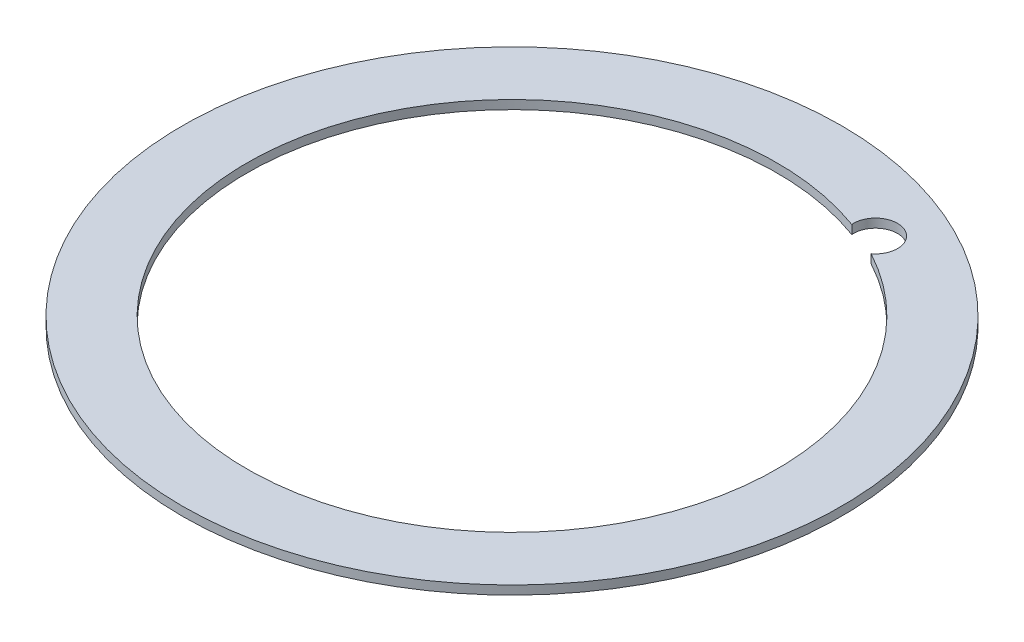
ISO-10303-21;
HEADER;
FILE_DESCRIPTION(('STEP AP214'),'2;1');
FILE_NAME('part.step','',(''),(''),'','','');
FILE_SCHEMA(('AUTOMOTIVE_DESIGN { 1 0 10303 214 1 1 1 1 }'));
ENDSEC;
DATA;
#1=APPLICATION_CONTEXT('core data for automotive mechanical design processes');
#2=APPLICATION_PROTOCOL_DEFINITION('international standard','automotive_design',2000,#1);
#3=PRODUCT_CONTEXT('',#1,'mechanical');
#4=PRODUCT('Part','Part','',(#3));
#5=PRODUCT_RELATED_PRODUCT_CATEGORY('part','',(#4));
#6=PRODUCT_DEFINITION_FORMATION('','',#4);
#7=PRODUCT_DEFINITION_CONTEXT('part definition',#1,'design');
#8=PRODUCT_DEFINITION('design','',#6,#7);
#9=PRODUCT_DEFINITION_SHAPE('','',#8);
#10=(LENGTH_UNIT() NAMED_UNIT(*) SI_UNIT(.MILLI.,.METRE.));
#11=(NAMED_UNIT(*) PLANE_ANGLE_UNIT() SI_UNIT($,.RADIAN.));
#12=(NAMED_UNIT(*) SI_UNIT($,.STERADIAN.) SOLID_ANGLE_UNIT());
#13=UNCERTAINTY_MEASURE_WITH_UNIT(LENGTH_MEASURE(1.E-05),#10,'distance_accuracy_value','');
#14=(GEOMETRIC_REPRESENTATION_CONTEXT(3) GLOBAL_UNCERTAINTY_ASSIGNED_CONTEXT((#13)) GLOBAL_UNIT_ASSIGNED_CONTEXT((#10,
#11,#12)) REPRESENTATION_CONTEXT('',''));
#15=CARTESIAN_POINT('',(0.,0.,0.));
#16=DIRECTION('',(0.,0.,1.));
#17=DIRECTION('',(1.,0.,0.));
#18=AXIS2_PLACEMENT_3D('',#15,#16,#17);
#19=CARTESIAN_POINT('',(48.7794749806911,-3.81,-108.820222521405));
#20=DIRECTION('',(0.,1.,0.));
#21=DIRECTION('',(0.,0.,1.));
#22=AXIS2_PLACEMENT_3D('',#19,#20,#21);
#23=CYLINDRICAL_SURFACE('',#22,9.52500000000001);
#24=CARTESIAN_POINT('',(48.7794749806911,0.,-108.820222521405));
#25=DIRECTION('',(0.,1.,0.));
#26=DIRECTION('',(0.,0.,1.));
#27=AXIS2_PLACEMENT_3D('',#24,#25,#26);
#28=CIRCLE('',#27,9.52500000000001);
#29=CARTESIAN_POINT('',(54.4903375460199,0.,-101.197121199769));
#30=VERTEX_POINT('',#29);
#31=CARTESIAN_POINT('',(39.2888878651294,0.,-108.011284203648));
#32=VERTEX_POINT('',#31);
#33=EDGE_CURVE('E69',#30,#32,#28,.T.);
#34=ORIENTED_EDGE('',*,*,#33,.T.);
#35=DIRECTION('',(0.,1.,0.));
#36=VECTOR('',#35,1.);
#37=CARTESIAN_POINT('',(39.2888878651294,-3.81,-108.011284203648));
#38=LINE('',#37,#36);
#39=CARTESIAN_POINT('',(39.2888878651294,-3.81,-108.011284203648));
#40=VERTEX_POINT('',#39);
#41=EDGE_CURVE('E11',#40,#32,#38,.T.);
#42=ORIENTED_EDGE('',*,*,#41,.F.);
#43=CARTESIAN_POINT('',(48.7794749806911,-3.81,-108.820222521405));
#44=DIRECTION('',(0.,1.,0.));
#45=DIRECTION('',(0.,0.,1.));
#46=AXIS2_PLACEMENT_3D('',#43,#44,#45);
#47=CIRCLE('',#46,9.52500000000001);
#48=CARTESIAN_POINT('',(54.4903375460199,-3.81,-101.197121199769));
#49=VERTEX_POINT('',#48);
#50=EDGE_CURVE('E82',#49,#40,#47,.T.);
#51=ORIENTED_EDGE('',*,*,#50,.F.);
#52=DIRECTION('',(0.,1.,0.));
#53=VECTOR('',#52,1.);
#54=CARTESIAN_POINT('',(54.4903375460199,-3.81,-101.197121199769));
#55=LINE('',#54,#53);
#56=EDGE_CURVE('E44',#49,#30,#55,.T.);
#57=ORIENTED_EDGE('',*,*,#56,.T.);
#58=EDGE_LOOP('',(#34,#42,#51,#57));
#59=FACE_BOUND('',#58,.T.);
#60=ADVANCED_FACE('F41',(#59),#23,.F.);
#61=CARTESIAN_POINT('',(0.,-3.81,0.));
#62=DIRECTION('',(0.,1.,0.));
#63=DIRECTION('',(0.,0.,1.));
#64=AXIS2_PLACEMENT_3D('',#61,#62,#63);
#65=CYLINDRICAL_SURFACE('',#64,114.935);
#66=CARTESIAN_POINT('',(0.,0.,0.));
#67=DIRECTION('',(0.,1.,0.));
#68=DIRECTION('',(0.,0.,1.));
#69=AXIS2_PLACEMENT_3D('',#66,#67,#68);
#70=CIRCLE('',#69,114.935);
#71=EDGE_CURVE('E62',#32,#30,#70,.T.);
#72=ORIENTED_EDGE('',*,*,#71,.T.);
#73=ORIENTED_EDGE('',*,*,#56,.F.);
#74=CARTESIAN_POINT('',(0.,-3.81,0.));
#75=DIRECTION('',(0.,1.,0.));
#76=DIRECTION('',(0.,0.,1.));
#77=AXIS2_PLACEMENT_3D('',#74,#75,#76);
#78=CIRCLE('',#77,114.935);
#79=EDGE_CURVE('E56',#40,#49,#78,.T.);
#80=ORIENTED_EDGE('',*,*,#79,.F.);
#81=ORIENTED_EDGE('',*,*,#41,.T.);
#82=EDGE_LOOP('',(#72,#73,#80,#81));
#83=FACE_BOUND('',#82,.T.);
#84=ADVANCED_FACE('F73',(#83),#65,.F.);
#85=CARTESIAN_POINT('',(0.,-3.81,0.));
#86=DIRECTION('',(0.,1.,0.));
#87=DIRECTION('',(0.,0.,1.));
#88=AXIS2_PLACEMENT_3D('',#85,#86,#87);
#89=CYLINDRICAL_SURFACE('',#88,142.875);
#90=CARTESIAN_POINT('',(0.,-3.81,0.));
#91=DIRECTION('',(0.,1.,0.));
#92=DIRECTION('',(0.,0.,1.));
#93=AXIS2_PLACEMENT_3D('',#90,#91,#92);
#94=CIRCLE('',#93,142.875);
#95=CARTESIAN_POINT('',(0.,-3.81,142.875));
#96=VERTEX_POINT('',#95);
#97=EDGE_CURVE('E78',#96,#96,#94,.T.);
#98=CARTESIAN_POINT('',(0.,0.,0.));
#99=DIRECTION('',(0.,1.,0.));
#100=DIRECTION('',(0.,0.,1.));
#101=AXIS2_PLACEMENT_3D('',#98,#99,#100);
#102=CIRCLE('',#101,142.875);
#103=CARTESIAN_POINT('',(0.,0.,142.875));
#104=VERTEX_POINT('',#103);
#105=EDGE_CURVE('E70',#104,#104,#102,.T.);
#106=CARTESIAN_POINT('',(0.,-3.81,142.875));
#107=CARTESIAN_POINT('',(0.,-3.7703125,142.875));
#108=CARTESIAN_POINT('',(0.,-3.730625,142.875));
#109=CARTESIAN_POINT('',(0.,-3.65125,142.875));
#110=CARTESIAN_POINT('',(0.,-3.6115625,142.875));
#111=CARTESIAN_POINT('',(0.,-3.5321875,142.875));
#112=CARTESIAN_POINT('',(0.,-3.4925,142.875));
#113=CARTESIAN_POINT('',(0.,-3.413125,142.875));
#114=CARTESIAN_POINT('',(0.,-3.3734375,142.875));
#115=CARTESIAN_POINT('',(0.,-3.2940625,142.875));
#116=CARTESIAN_POINT('',(0.,-3.254375,142.875));
#117=CARTESIAN_POINT('',(0.,-3.175,142.875));
#118=CARTESIAN_POINT('',(0.,-3.1353125,142.875));
#119=CARTESIAN_POINT('',(0.,-3.0559375,142.875));
#120=CARTESIAN_POINT('',(0.,-3.01625,142.875));
#121=CARTESIAN_POINT('',(0.,-2.936875,142.875));
#122=CARTESIAN_POINT('',(0.,-2.8971875,142.875));
#123=CARTESIAN_POINT('',(0.,-2.8178125,142.875));
#124=CARTESIAN_POINT('',(0.,-2.778125,142.875));
#125=CARTESIAN_POINT('',(0.,-2.69875,142.875));
#126=CARTESIAN_POINT('',(0.,-2.6590625,142.875));
#127=CARTESIAN_POINT('',(0.,-2.5796875,142.875));
#128=CARTESIAN_POINT('',(0.,-2.54,142.875));
#129=CARTESIAN_POINT('',(0.,-2.460625,142.875));
#130=CARTESIAN_POINT('',(0.,-2.4209375,142.875));
#131=CARTESIAN_POINT('',(0.,-2.3415625,142.875));
#132=CARTESIAN_POINT('',(0.,-2.301875,142.875));
#133=CARTESIAN_POINT('',(0.,-2.2225,142.875));
#134=CARTESIAN_POINT('',(0.,-2.1828125,142.875));
#135=CARTESIAN_POINT('',(0.,-2.1034375,142.875));
#136=CARTESIAN_POINT('',(0.,-2.06375,142.875));
#137=CARTESIAN_POINT('',(0.,-1.984375,142.875));
#138=CARTESIAN_POINT('',(0.,-1.9446875,142.875));
#139=CARTESIAN_POINT('',(0.,-1.8653125,142.875));
#140=CARTESIAN_POINT('',(0.,-1.825625,142.875));
#141=CARTESIAN_POINT('',(0.,-1.74625,142.875));
#142=CARTESIAN_POINT('',(0.,-1.7065625,142.875));
#143=CARTESIAN_POINT('',(0.,-1.6271875,142.875));
#144=CARTESIAN_POINT('',(0.,-1.5875,142.875));
#145=CARTESIAN_POINT('',(0.,-1.508125,142.875));
#146=CARTESIAN_POINT('',(0.,-1.4684375,142.875));
#147=CARTESIAN_POINT('',(0.,-1.3890625,142.875));
#148=CARTESIAN_POINT('',(0.,-1.349375,142.875));
#149=CARTESIAN_POINT('',(0.,-1.27,142.875));
#150=CARTESIAN_POINT('',(0.,-1.2303125,142.875));
#151=CARTESIAN_POINT('',(0.,-1.1509375,142.875));
#152=CARTESIAN_POINT('',(0.,-1.11125,142.875));
#153=CARTESIAN_POINT('',(0.,-1.031875,142.875));
#154=CARTESIAN_POINT('',(0.,-0.9921875,142.875));
#155=CARTESIAN_POINT('',(0.,-0.9128125,142.875));
#156=CARTESIAN_POINT('',(0.,-0.873125,142.875));
#157=CARTESIAN_POINT('',(0.,-0.79375,142.875));
#158=CARTESIAN_POINT('',(0.,-0.7540625,142.875));
#159=CARTESIAN_POINT('',(0.,-0.6746875,142.875));
#160=CARTESIAN_POINT('',(0.,-0.635,142.875));
#161=CARTESIAN_POINT('',(0.,-0.555625,142.875));
#162=CARTESIAN_POINT('',(0.,-0.5159375,142.875));
#163=CARTESIAN_POINT('',(0.,-0.4365625,142.875));
#164=CARTESIAN_POINT('',(0.,-0.396875,142.875));
#165=CARTESIAN_POINT('',(0.,-0.3175,142.875));
#166=CARTESIAN_POINT('',(0.,-0.2778125,142.875));
#167=CARTESIAN_POINT('',(0.,-0.1984375,142.875));
#168=CARTESIAN_POINT('',(0.,-0.15875,142.875));
#169=CARTESIAN_POINT('',(0.,-0.0793749999999999,142.875));
#170=CARTESIAN_POINT('',(0.,-0.0396874999999999,142.875));
#171=CARTESIAN_POINT('',(0.,0.,142.875));
#172=B_SPLINE_CURVE_WITH_KNOTS('',3,(#106,#107,#108,#109,#110,#111,#112,#113,#114,#115,#116,
#117,#118,#119,#120,#121,#122,#123,#124,#125,#126,#127,#128,#129,#130,#131,#132,#133,#134,#135,
#136,#137,#138,#139,#140,#141,#142,#143,#144,#145,#146,#147,#148,#149,#150,#151,#152,#153,#154,
#155,#156,#157,#158,#159,#160,#161,#162,#163,#164,#165,#166,#167,#168,#169,#170,#171),
.UNSPECIFIED.,.F.,.F.,(4,2,2,2,2,2,2,2,2,2,2,2,2,2,2,2,2,2,2,2,2,2,2,2,2,2,2,2,2,2,2,2,4),(0.,
0.1190625,0.238125,0.3571875,0.47625,0.5953125,0.714375,0.833437499999999,0.9525,1.0715625,
1.190625,1.3096875,1.42875,1.5478125,1.666875,1.7859375,1.905,2.0240625,2.143125,2.2621875,
2.38125,2.5003125,2.619375,2.7384375,2.8575,2.9765625,3.095625,3.2146875,3.33375,3.4528125,
3.571875,3.6909375,3.81),.UNSPECIFIED.);
#173=EDGE_CURVE('BSEAM89',#96,#104,#172,.T.);
#174=ORIENTED_EDGE('',*,*,#97,.T.);
#175=ORIENTED_EDGE('',*,*,#105,.F.);
#176=ORIENTED_EDGE('',*,*,#173,.T.);
#177=ORIENTED_EDGE('',*,*,#173,.F.);
#178=EDGE_LOOP('',(#174,#176,#175,#177));
#179=FACE_BOUND('',#178,.T.);
#180=ADVANCED_FACE('F89',(#179),#89,.T.);
#181=CARTESIAN_POINT('',(0.,-3.81,0.));
#182=DIRECTION('',(0.,1.,0.));
#183=DIRECTION('',(0.,0.,1.));
#184=AXIS2_PLACEMENT_3D('',#181,#182,#183);
#185=PLANE('',#184);
#186=ORIENTED_EDGE('',*,*,#50,.T.);
#187=ORIENTED_EDGE('',*,*,#79,.T.);
#188=EDGE_LOOP('',(#186,#187));
#189=FACE_BOUND('',#188,.T.);
#190=ORIENTED_EDGE('',*,*,#97,.F.);
#191=EDGE_LOOP('',(#190));
#192=FACE_BOUND('',#191,.T.);
#193=ADVANCED_FACE('F92',(#189,#192),#185,.F.);
#194=CARTESIAN_POINT('',(0.,0.,0.));
#195=DIRECTION('',(0.,1.,0.));
#196=DIRECTION('',(0.,0.,1.));
#197=AXIS2_PLACEMENT_3D('',#194,#195,#196);
#198=PLANE('',#197);
#199=ORIENTED_EDGE('',*,*,#33,.F.);
#200=ORIENTED_EDGE('',*,*,#71,.F.);
#201=EDGE_LOOP('',(#199,#200));
#202=FACE_BOUND('',#201,.T.);
#203=ORIENTED_EDGE('',*,*,#105,.T.);
#204=EDGE_LOOP('',(#203));
#205=FACE_BOUND('',#204,.T.);
#206=ADVANCED_FACE('F66',(#202,#205),#198,.T.);
#207=CLOSED_SHELL('',(#60,#84,#180,#193,#206));
#208=MANIFOLD_SOLID_BREP('B2',#207);
#209=ADVANCED_BREP_SHAPE_REPRESENTATION('',(#18,#208),#14);
#210=SHAPE_DEFINITION_REPRESENTATION(#9,#209);
ENDSEC;
END-ISO-10303-21;
